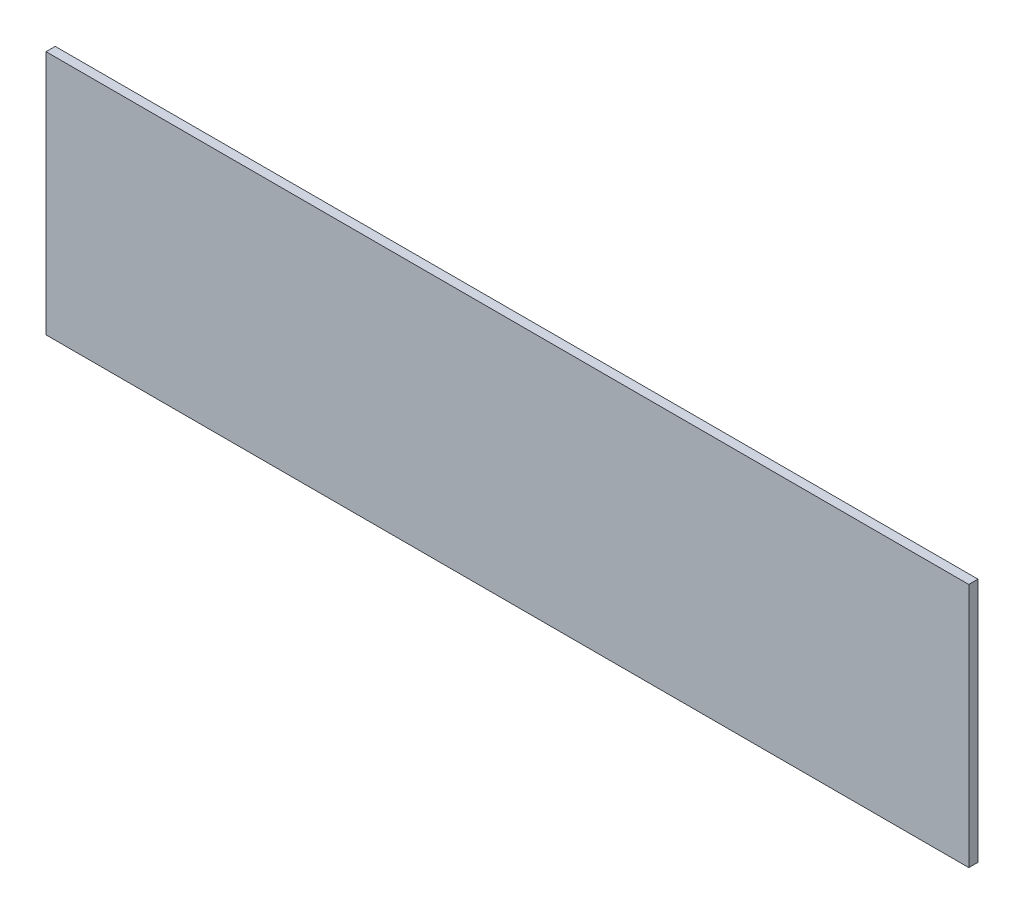
ISO-10303-21;
HEADER;
FILE_DESCRIPTION(('STEP AP214'),'2;1');
FILE_NAME('part.step','',(''),(''),'','','');
FILE_SCHEMA(('AUTOMOTIVE_DESIGN { 1 0 10303 214 1 1 1 1 }'));
ENDSEC;
DATA;
#1=APPLICATION_CONTEXT('core data for automotive mechanical design processes');
#2=APPLICATION_PROTOCOL_DEFINITION('international standard','automotive_design',2000,#1);
#3=PRODUCT_CONTEXT('',#1,'mechanical');
#4=PRODUCT('Part','Part','',(#3));
#5=PRODUCT_RELATED_PRODUCT_CATEGORY('part','',(#4));
#6=PRODUCT_DEFINITION_FORMATION('','',#4);
#7=PRODUCT_DEFINITION_CONTEXT('part definition',#1,'design');
#8=PRODUCT_DEFINITION('design','',#6,#7);
#9=PRODUCT_DEFINITION_SHAPE('','',#8);
#10=(LENGTH_UNIT() NAMED_UNIT(*) SI_UNIT(.MILLI.,.METRE.));
#11=(NAMED_UNIT(*) PLANE_ANGLE_UNIT() SI_UNIT($,.RADIAN.));
#12=(NAMED_UNIT(*) SI_UNIT($,.STERADIAN.) SOLID_ANGLE_UNIT());
#13=UNCERTAINTY_MEASURE_WITH_UNIT(LENGTH_MEASURE(1.E-05),#10,'distance_accuracy_value','');
#14=(GEOMETRIC_REPRESENTATION_CONTEXT(3) GLOBAL_UNCERTAINTY_ASSIGNED_CONTEXT((#13)) GLOBAL_UNIT_ASSIGNED_CONTEXT((#10,
#11,#12)) REPRESENTATION_CONTEXT('',''));
#15=CARTESIAN_POINT('',(0.,0.,0.));
#16=DIRECTION('',(0.,0.,1.));
#17=DIRECTION('',(1.,0.,0.));
#18=AXIS2_PLACEMENT_3D('',#15,#16,#17);
#19=CARTESIAN_POINT('',(0.,0.,3.));
#20=DIRECTION('',(-1.,0.,0.));
#21=DIRECTION('',(0.,-1.,0.));
#22=AXIS2_PLACEMENT_3D('',#19,#20,#21);
#23=PLANE('',#22);
#24=DIRECTION('',(0.,1.,0.));
#25=VECTOR('',#24,1.);
#26=CARTESIAN_POINT('',(0.,0.,0.));
#27=LINE('',#26,#25);
#28=CARTESIAN_POINT('',(0.,0.,0.));
#29=VERTEX_POINT('',#28);
#30=CARTESIAN_POINT('',(0.,80.,0.));
#31=VERTEX_POINT('',#30);
#32=EDGE_CURVE('E96',#29,#31,#27,.T.);
#33=ORIENTED_EDGE('',*,*,#32,.T.);
#34=DIRECTION('',(0.,0.,-1.));
#35=VECTOR('',#34,1.);
#36=CARTESIAN_POINT('',(0.,80.,3.));
#37=LINE('',#36,#35);
#38=CARTESIAN_POINT('',(0.,80.,3.));
#39=VERTEX_POINT('',#38);
#40=EDGE_CURVE('E11',#39,#31,#37,.T.);
#41=ORIENTED_EDGE('',*,*,#40,.F.);
#42=DIRECTION('',(0.,1.,0.));
#43=VECTOR('',#42,1.);
#44=CARTESIAN_POINT('',(0.,0.,3.));
#45=LINE('',#44,#43);
#46=CARTESIAN_POINT('',(0.,0.,3.));
#47=VERTEX_POINT('',#46);
#48=EDGE_CURVE('E84',#47,#39,#45,.T.);
#49=ORIENTED_EDGE('',*,*,#48,.F.);
#50=DIRECTION('',(0.,0.,-1.));
#51=VECTOR('',#50,1.);
#52=CARTESIAN_POINT('',(0.,0.,3.));
#53=LINE('',#52,#51);
#54=EDGE_CURVE('E92',#47,#29,#53,.T.);
#55=ORIENTED_EDGE('',*,*,#54,.T.);
#56=EDGE_LOOP('',(#33,#41,#49,#55));
#57=FACE_BOUND('',#56,.T.);
#58=ADVANCED_FACE('F33',(#57),#23,.F.);
#59=CARTESIAN_POINT('',(0.,80.,3.));
#60=DIRECTION('',(0.,-1.,0.));
#61=DIRECTION('',(1.,0.,0.));
#62=AXIS2_PLACEMENT_3D('',#59,#60,#61);
#63=PLANE('',#62);
#64=DIRECTION('',(-1.,0.,0.));
#65=VECTOR('',#64,1.);
#66=CARTESIAN_POINT('',(0.,80.,0.));
#67=LINE('',#66,#65);
#68=CARTESIAN_POINT('',(-301.,80.,0.));
#69=VERTEX_POINT('',#68);
#70=EDGE_CURVE('E88',#31,#69,#67,.T.);
#71=ORIENTED_EDGE('',*,*,#70,.T.);
#72=DIRECTION('',(0.,0.,-1.));
#73=VECTOR('',#72,1.);
#74=CARTESIAN_POINT('',(-301.,80.,3.));
#75=LINE('',#74,#73);
#76=CARTESIAN_POINT('',(-301.,80.,3.));
#77=VERTEX_POINT('',#76);
#78=EDGE_CURVE('E41',#77,#69,#75,.T.);
#79=ORIENTED_EDGE('',*,*,#78,.F.);
#80=DIRECTION('',(-1.,0.,0.));
#81=VECTOR('',#80,1.);
#82=CARTESIAN_POINT('',(0.,80.,3.));
#83=LINE('',#82,#81);
#84=EDGE_CURVE('E79',#39,#77,#83,.T.);
#85=ORIENTED_EDGE('',*,*,#84,.F.);
#86=ORIENTED_EDGE('',*,*,#40,.T.);
#87=EDGE_LOOP('',(#71,#79,#85,#86));
#88=FACE_BOUND('',#87,.T.);
#89=ADVANCED_FACE('F87',(#88),#63,.F.);
#90=CARTESIAN_POINT('',(-301.,0.,3.));
#91=DIRECTION('',(1.,0.,0.));
#92=DIRECTION('',(0.,0.,-1.));
#93=AXIS2_PLACEMENT_3D('',#90,#91,#92);
#94=PLANE('',#93);
#95=DIRECTION('',(0.,-1.,0.));
#96=VECTOR('',#95,1.);
#97=CARTESIAN_POINT('',(-301.,0.,0.));
#98=LINE('',#97,#96);
#99=CARTESIAN_POINT('',(-301.,0.,0.));
#100=VERTEX_POINT('',#99);
#101=EDGE_CURVE('E66',#69,#100,#98,.T.);
#102=ORIENTED_EDGE('',*,*,#101,.T.);
#103=DIRECTION('',(0.,0.,-1.));
#104=VECTOR('',#103,1.);
#105=CARTESIAN_POINT('',(-301.,0.,3.));
#106=LINE('',#105,#104);
#107=CARTESIAN_POINT('',(-301.,0.,3.));
#108=VERTEX_POINT('',#107);
#109=EDGE_CURVE('E89',#108,#100,#106,.T.);
#110=ORIENTED_EDGE('',*,*,#109,.F.);
#111=DIRECTION('',(0.,-1.,0.));
#112=VECTOR('',#111,1.);
#113=CARTESIAN_POINT('',(-301.,0.,3.));
#114=LINE('',#113,#112);
#115=EDGE_CURVE('E82',#77,#108,#114,.T.);
#116=ORIENTED_EDGE('',*,*,#115,.F.);
#117=ORIENTED_EDGE('',*,*,#78,.T.);
#118=EDGE_LOOP('',(#102,#110,#116,#117));
#119=FACE_BOUND('',#118,.T.);
#120=ADVANCED_FACE('F90',(#119),#94,.F.);
#121=CARTESIAN_POINT('',(0.,0.,3.));
#122=DIRECTION('',(0.,1.,0.));
#123=DIRECTION('',(-1.,0.,0.));
#124=AXIS2_PLACEMENT_3D('',#121,#122,#123);
#125=PLANE('',#124);
#126=DIRECTION('',(1.,0.,0.));
#127=VECTOR('',#126,1.);
#128=CARTESIAN_POINT('',(0.,0.,0.));
#129=LINE('',#128,#127);
#130=EDGE_CURVE('E72',#100,#29,#129,.T.);
#131=ORIENTED_EDGE('',*,*,#130,.T.);
#132=ORIENTED_EDGE('',*,*,#54,.F.);
#133=DIRECTION('',(1.,0.,0.));
#134=VECTOR('',#133,1.);
#135=CARTESIAN_POINT('',(0.,0.,3.));
#136=LINE('',#135,#134);
#137=EDGE_CURVE('E49',#108,#47,#136,.T.);
#138=ORIENTED_EDGE('',*,*,#137,.F.);
#139=ORIENTED_EDGE('',*,*,#109,.T.);
#140=EDGE_LOOP('',(#131,#132,#138,#139));
#141=FACE_BOUND('',#140,.T.);
#142=ADVANCED_FACE('F103',(#141),#125,.F.);
#143=CARTESIAN_POINT('',(0.,0.,3.));
#144=DIRECTION('',(0.,0.,1.));
#145=DIRECTION('',(1.,0.,0.));
#146=AXIS2_PLACEMENT_3D('',#143,#144,#145);
#147=PLANE('',#146);
#148=ORIENTED_EDGE('',*,*,#48,.T.);
#149=ORIENTED_EDGE('',*,*,#84,.T.);
#150=ORIENTED_EDGE('',*,*,#115,.T.);
#151=ORIENTED_EDGE('',*,*,#137,.T.);
#152=EDGE_LOOP('',(#148,#149,#150,#151));
#153=FACE_BOUND('',#152,.T.);
#154=ADVANCED_FACE('F80',(#153),#147,.T.);
#155=CARTESIAN_POINT('',(0.,0.,0.));
#156=DIRECTION('',(0.,0.,1.));
#157=DIRECTION('',(1.,0.,0.));
#158=AXIS2_PLACEMENT_3D('',#155,#156,#157);
#159=PLANE('',#158);
#160=ORIENTED_EDGE('',*,*,#32,.F.);
#161=ORIENTED_EDGE('',*,*,#130,.F.);
#162=ORIENTED_EDGE('',*,*,#101,.F.);
#163=ORIENTED_EDGE('',*,*,#70,.F.);
#164=EDGE_LOOP('',(#160,#161,#162,#163));
#165=FACE_BOUND('',#164,.T.);
#166=ADVANCED_FACE('F106',(#165),#159,.F.);
#167=CLOSED_SHELL('',(#58,#89,#120,#142,#154,#166));
#168=MANIFOLD_SOLID_BREP('B2',#167);
#169=ADVANCED_BREP_SHAPE_REPRESENTATION('',(#18,#168),#14);
#170=SHAPE_DEFINITION_REPRESENTATION(#9,#169);
ENDSEC;
END-ISO-10303-21;
